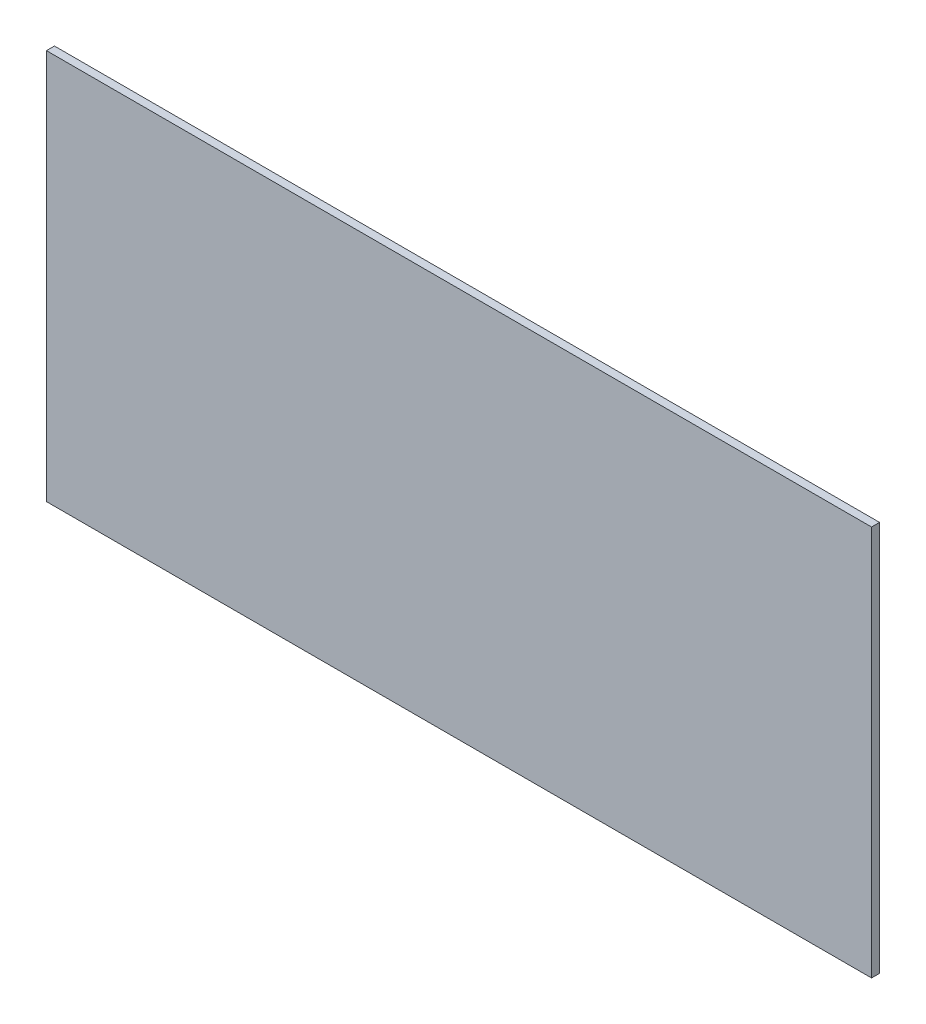
ISO-10303-21;
HEADER;
FILE_DESCRIPTION(('STEP AP214'),'2;1');
FILE_NAME('part.step','',(''),(''),'','','');
FILE_SCHEMA(('AUTOMOTIVE_DESIGN { 1 0 10303 214 1 1 1 1 }'));
ENDSEC;
DATA;
#1=APPLICATION_CONTEXT('core data for automotive mechanical design processes');
#2=APPLICATION_PROTOCOL_DEFINITION('international standard','automotive_design',2000,#1);
#3=PRODUCT_CONTEXT('',#1,'mechanical');
#4=PRODUCT('Part','Part','',(#3));
#5=PRODUCT_RELATED_PRODUCT_CATEGORY('part','',(#4));
#6=PRODUCT_DEFINITION_FORMATION('','',#4);
#7=PRODUCT_DEFINITION_CONTEXT('part definition',#1,'design');
#8=PRODUCT_DEFINITION('design','',#6,#7);
#9=PRODUCT_DEFINITION_SHAPE('','',#8);
#10=(LENGTH_UNIT() NAMED_UNIT(*) SI_UNIT(.MILLI.,.METRE.));
#11=(NAMED_UNIT(*) PLANE_ANGLE_UNIT() SI_UNIT($,.RADIAN.));
#12=(NAMED_UNIT(*) SI_UNIT($,.STERADIAN.) SOLID_ANGLE_UNIT());
#13=UNCERTAINTY_MEASURE_WITH_UNIT(LENGTH_MEASURE(1.E-05),#10,'distance_accuracy_value','');
#14=(GEOMETRIC_REPRESENTATION_CONTEXT(3) GLOBAL_UNCERTAINTY_ASSIGNED_CONTEXT((#13)) GLOBAL_UNIT_ASSIGNED_CONTEXT((#10,
#11,#12)) REPRESENTATION_CONTEXT('',''));
#15=CARTESIAN_POINT('',(0.,0.,0.));
#16=DIRECTION('',(0.,0.,1.));
#17=DIRECTION('',(1.,0.,0.));
#18=AXIS2_PLACEMENT_3D('',#15,#16,#17);
#19=CARTESIAN_POINT('',(-9.76600219929391,-47.9921419736211,1.6));
#20=DIRECTION('',(1.,0.,0.));
#21=DIRECTION('',(0.,0.,-1.));
#22=AXIS2_PLACEMENT_3D('',#19,#20,#21);
#23=PLANE('',#22);
#24=DIRECTION('',(0.,-1.,0.));
#25=VECTOR('',#24,1.);
#26=CARTESIAN_POINT('',(-9.76600219929391,-47.9921419736211,0.));
#27=LINE('',#26,#25);
#28=CARTESIAN_POINT('',(-9.76600219929391,30.1103547863789,0.));
#29=VERTEX_POINT('',#28);
#30=CARTESIAN_POINT('',(-9.76600219929391,-47.9921419736211,0.));
#31=VERTEX_POINT('',#30);
#32=EDGE_CURVE('E103',#29,#31,#27,.T.);
#33=ORIENTED_EDGE('',*,*,#32,.T.);
#34=DIRECTION('',(0.,0.,-1.));
#35=VECTOR('',#34,1.);
#36=CARTESIAN_POINT('',(-9.76600219929391,-47.9921419736211,1.6));
#37=LINE('',#36,#35);
#38=CARTESIAN_POINT('',(-9.76600219929391,-47.9921419736211,1.6));
#39=VERTEX_POINT('',#38);
#40=EDGE_CURVE('E11',#39,#31,#37,.T.);
#41=ORIENTED_EDGE('',*,*,#40,.F.);
#42=DIRECTION('',(0.,-1.,0.));
#43=VECTOR('',#42,1.);
#44=CARTESIAN_POINT('',(-9.76600219929391,-47.9921419736211,1.6));
#45=LINE('',#44,#43);
#46=CARTESIAN_POINT('',(-9.76600219929391,30.1103547863789,1.6));
#47=VERTEX_POINT('',#46);
#48=EDGE_CURVE('E91',#47,#39,#45,.T.);
#49=ORIENTED_EDGE('',*,*,#48,.F.);
#50=DIRECTION('',(0.,0.,-1.));
#51=VECTOR('',#50,1.);
#52=CARTESIAN_POINT('',(-9.76600219929391,30.1103547863789,1.6));
#53=LINE('',#52,#51);
#54=EDGE_CURVE('E99',#47,#29,#53,.T.);
#55=ORIENTED_EDGE('',*,*,#54,.T.);
#56=EDGE_LOOP('',(#33,#41,#49,#55));
#57=FACE_BOUND('',#56,.T.);
#58=ADVANCED_FACE('F40',(#57),#23,.F.);
#59=CARTESIAN_POINT('',(155.233997800706,-47.9921419736211,1.6));
#60=DIRECTION('',(0.,1.,0.));
#61=DIRECTION('',(-1.,0.,0.));
#62=AXIS2_PLACEMENT_3D('',#59,#60,#61);
#63=PLANE('',#62);
#64=DIRECTION('',(1.,0.,0.));
#65=VECTOR('',#64,1.);
#66=CARTESIAN_POINT('',(155.233997800706,-47.9921419736211,0.));
#67=LINE('',#66,#65);
#68=CARTESIAN_POINT('',(155.233997800706,-47.9921419736211,0.));
#69=VERTEX_POINT('',#68);
#70=EDGE_CURVE('E95',#31,#69,#67,.T.);
#71=ORIENTED_EDGE('',*,*,#70,.T.);
#72=DIRECTION('',(0.,0.,-1.));
#73=VECTOR('',#72,1.);
#74=CARTESIAN_POINT('',(155.233997800706,-47.9921419736211,1.6));
#75=LINE('',#74,#73);
#76=CARTESIAN_POINT('',(155.233997800706,-47.9921419736211,1.6));
#77=VERTEX_POINT('',#76);
#78=EDGE_CURVE('E48',#77,#69,#75,.T.);
#79=ORIENTED_EDGE('',*,*,#78,.F.);
#80=DIRECTION('',(1.,0.,0.));
#81=VECTOR('',#80,1.);
#82=CARTESIAN_POINT('',(155.233997800706,-47.9921419736211,1.6));
#83=LINE('',#82,#81);
#84=EDGE_CURVE('E86',#39,#77,#83,.T.);
#85=ORIENTED_EDGE('',*,*,#84,.F.);
#86=ORIENTED_EDGE('',*,*,#40,.T.);
#87=EDGE_LOOP('',(#71,#79,#85,#86));
#88=FACE_BOUND('',#87,.T.);
#89=ADVANCED_FACE('F94',(#88),#63,.F.);
#90=CARTESIAN_POINT('',(155.233997800706,30.1103547863789,1.6));
#91=DIRECTION('',(-1.,0.,0.));
#92=DIRECTION('',(0.,-1.,0.));
#93=AXIS2_PLACEMENT_3D('',#90,#91,#92);
#94=PLANE('',#93);
#95=DIRECTION('',(0.,1.,0.));
#96=VECTOR('',#95,1.);
#97=CARTESIAN_POINT('',(155.233997800706,30.1103547863789,0.));
#98=LINE('',#97,#96);
#99=CARTESIAN_POINT('',(155.233997800706,30.1103547863789,0.));
#100=VERTEX_POINT('',#99);
#101=EDGE_CURVE('E73',#69,#100,#98,.T.);
#102=ORIENTED_EDGE('',*,*,#101,.T.);
#103=DIRECTION('',(0.,0.,-1.));
#104=VECTOR('',#103,1.);
#105=CARTESIAN_POINT('',(155.233997800706,30.1103547863789,1.6));
#106=LINE('',#105,#104);
#107=CARTESIAN_POINT('',(155.233997800706,30.1103547863789,1.6));
#108=VERTEX_POINT('',#107);
#109=EDGE_CURVE('E96',#108,#100,#106,.T.);
#110=ORIENTED_EDGE('',*,*,#109,.F.);
#111=DIRECTION('',(0.,1.,0.));
#112=VECTOR('',#111,1.);
#113=CARTESIAN_POINT('',(155.233997800706,30.1103547863789,1.6));
#114=LINE('',#113,#112);
#115=EDGE_CURVE('E89',#77,#108,#114,.T.);
#116=ORIENTED_EDGE('',*,*,#115,.F.);
#117=ORIENTED_EDGE('',*,*,#78,.T.);
#118=EDGE_LOOP('',(#102,#110,#116,#117));
#119=FACE_BOUND('',#118,.T.);
#120=ADVANCED_FACE('F97',(#119),#94,.F.);
#121=CARTESIAN_POINT('',(-9.76600219929391,30.1103547863789,1.6));
#122=DIRECTION('',(0.,-1.,0.));
#123=DIRECTION('',(0.,0.,-1.));
#124=AXIS2_PLACEMENT_3D('',#121,#122,#123);
#125=PLANE('',#124);
#126=DIRECTION('',(-1.,0.,0.));
#127=VECTOR('',#126,1.);
#128=CARTESIAN_POINT('',(-9.76600219929391,30.1103547863789,0.));
#129=LINE('',#128,#127);
#130=EDGE_CURVE('E79',#100,#29,#129,.T.);
#131=ORIENTED_EDGE('',*,*,#130,.T.);
#132=ORIENTED_EDGE('',*,*,#54,.F.);
#133=DIRECTION('',(-1.,0.,0.));
#134=VECTOR('',#133,1.);
#135=CARTESIAN_POINT('',(-9.76600219929391,30.1103547863789,1.6));
#136=LINE('',#135,#134);
#137=EDGE_CURVE('E56',#108,#47,#136,.T.);
#138=ORIENTED_EDGE('',*,*,#137,.F.);
#139=ORIENTED_EDGE('',*,*,#109,.T.);
#140=EDGE_LOOP('',(#131,#132,#138,#139));
#141=FACE_BOUND('',#140,.T.);
#142=ADVANCED_FACE('F110',(#141),#125,.F.);
#143=CARTESIAN_POINT('',(0.,0.,1.6));
#144=DIRECTION('',(0.,0.,-1.));
#145=DIRECTION('',(-1.,0.,0.));
#146=AXIS2_PLACEMENT_3D('',#143,#144,#145);
#147=PLANE('',#146);
#148=ORIENTED_EDGE('',*,*,#48,.T.);
#149=ORIENTED_EDGE('',*,*,#84,.T.);
#150=ORIENTED_EDGE('',*,*,#115,.T.);
#151=ORIENTED_EDGE('',*,*,#137,.T.);
#152=EDGE_LOOP('',(#148,#149,#150,#151));
#153=FACE_BOUND('',#152,.T.);
#154=ADVANCED_FACE('F87',(#153),#147,.F.);
#155=CARTESIAN_POINT('',(0.,0.,0.));
#156=DIRECTION('',(0.,0.,-1.));
#157=DIRECTION('',(-1.,0.,0.));
#158=AXIS2_PLACEMENT_3D('',#155,#156,#157);
#159=PLANE('',#158);
#160=ORIENTED_EDGE('',*,*,#32,.F.);
#161=ORIENTED_EDGE('',*,*,#130,.F.);
#162=ORIENTED_EDGE('',*,*,#101,.F.);
#163=ORIENTED_EDGE('',*,*,#70,.F.);
#164=EDGE_LOOP('',(#160,#161,#162,#163));
#165=FACE_BOUND('',#164,.T.);
#166=ADVANCED_FACE('F113',(#165),#159,.T.);
#167=CLOSED_SHELL('',(#58,#89,#120,#142,#154,#166));
#168=MANIFOLD_SOLID_BREP('B2',#167);
#169=ADVANCED_BREP_SHAPE_REPRESENTATION('',(#18,#168),#14);
#170=SHAPE_DEFINITION_REPRESENTATION(#9,#169);
ENDSEC;
END-ISO-10303-21;
